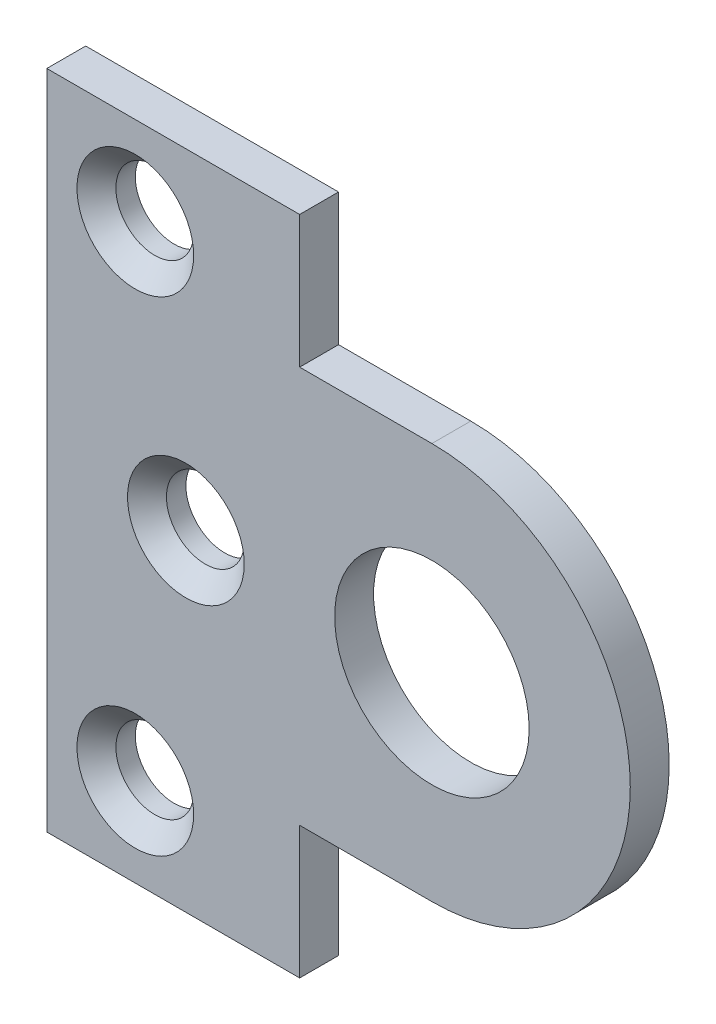
ISO-10303-21;
HEADER;
FILE_DESCRIPTION(('STEP AP214'),'2;1');
FILE_NAME('part.step','',(''),(''),'','','');
FILE_SCHEMA(('AUTOMOTIVE_DESIGN { 1 0 10303 214 1 1 1 1 }'));
ENDSEC;
DATA;
#1=APPLICATION_CONTEXT('core data for automotive mechanical design processes');
#2=APPLICATION_PROTOCOL_DEFINITION('international standard','automotive_design',2000,#1);
#3=PRODUCT_CONTEXT('',#1,'mechanical');
#4=PRODUCT('Part','Part','',(#3));
#5=PRODUCT_RELATED_PRODUCT_CATEGORY('part','',(#4));
#6=PRODUCT_DEFINITION_FORMATION('','',#4);
#7=PRODUCT_DEFINITION_CONTEXT('part definition',#1,'design');
#8=PRODUCT_DEFINITION('design','',#6,#7);
#9=PRODUCT_DEFINITION_SHAPE('','',#8);
#10=(LENGTH_UNIT() NAMED_UNIT(*) SI_UNIT(.MILLI.,.METRE.));
#11=(NAMED_UNIT(*) PLANE_ANGLE_UNIT() SI_UNIT($,.RADIAN.));
#12=(NAMED_UNIT(*) SI_UNIT($,.STERADIAN.) SOLID_ANGLE_UNIT());
#13=UNCERTAINTY_MEASURE_WITH_UNIT(LENGTH_MEASURE(1.E-05),#10,'distance_accuracy_value','');
#14=(GEOMETRIC_REPRESENTATION_CONTEXT(3) GLOBAL_UNCERTAINTY_ASSIGNED_CONTEXT((#13)) GLOBAL_UNIT_ASSIGNED_CONTEXT((#10,
#11,#12)) REPRESENTATION_CONTEXT('',''));
#15=CARTESIAN_POINT('',(0.,0.,0.));
#16=DIRECTION('',(0.,0.,1.));
#17=DIRECTION('',(1.,0.,0.));
#18=AXIS2_PLACEMENT_3D('',#15,#16,#17);
#19=CARTESIAN_POINT('',(0.,0.,3.175));
#20=DIRECTION('',(0.,0.,1.));
#21=DIRECTION('',(1.,0.,0.));
#22=AXIS2_PLACEMENT_3D('',#19,#20,#21);
#23=PLANE('',#22);
#24=CARTESIAN_POINT('',(-24.209375,-19.764375,3.175));
#25=DIRECTION('',(0.,0.,1.));
#26=DIRECTION('',(1.,0.,0.));
#27=AXIS2_PLACEMENT_3D('',#24,#25,#26);
#28=CIRCLE('',#27,4.7625);
#29=CARTESIAN_POINT('',(-19.446875,-19.764375,3.175));
#30=VERTEX_POINT('',#29);
#31=EDGE_CURVE('E198',#30,#30,#28,.F.);
#32=ORIENTED_EDGE('',*,*,#31,.T.);
#33=EDGE_LOOP('',(#32));
#34=FACE_BOUND('',#33,.T.);
#35=CARTESIAN_POINT('',(-20.081875,0.,3.175));
#36=DIRECTION('',(0.,0.,1.));
#37=DIRECTION('',(1.,0.,0.));
#38=AXIS2_PLACEMENT_3D('',#35,#36,#37);
#39=CIRCLE('',#38,4.7625);
#40=CARTESIAN_POINT('',(-15.319375,0.,3.175));
#41=VERTEX_POINT('',#40);
#42=EDGE_CURVE('E194',#41,#41,#39,.F.);
#43=ORIENTED_EDGE('',*,*,#42,.T.);
#44=EDGE_LOOP('',(#43));
#45=FACE_BOUND('',#44,.T.);
#46=CARTESIAN_POINT('',(-24.209375,19.764375,3.175));
#47=DIRECTION('',(0.,0.,1.));
#48=DIRECTION('',(1.,0.,0.));
#49=AXIS2_PLACEMENT_3D('',#46,#47,#48);
#50=CIRCLE('',#49,4.7625);
#51=CARTESIAN_POINT('',(-19.446875,19.764375,3.175));
#52=VERTEX_POINT('',#51);
#53=EDGE_CURVE('E190',#52,#52,#50,.F.);
#54=ORIENTED_EDGE('',*,*,#53,.T.);
#55=EDGE_LOOP('',(#54));
#56=FACE_BOUND('',#55,.T.);
#57=CARTESIAN_POINT('',(0.,0.,3.175));
#58=DIRECTION('',(0.,0.,1.));
#59=DIRECTION('',(1.,0.,0.));
#60=AXIS2_PLACEMENT_3D('',#57,#58,#59);
#61=CIRCLE('',#60,7.9375);
#62=CARTESIAN_POINT('',(7.9375,0.,3.175));
#63=VERTEX_POINT('',#62);
#64=EDGE_CURVE('E146',#63,#63,#61,.T.);
#65=ORIENTED_EDGE('',*,*,#64,.F.);
#66=EDGE_LOOP('',(#65));
#67=FACE_BOUND('',#66,.T.);
#68=CARTESIAN_POINT('',(0.,0.,3.175));
#69=DIRECTION('',(0.,0.,1.));
#70=DIRECTION('',(1.,0.,0.));
#71=AXIS2_PLACEMENT_3D('',#68,#69,#70);
#72=CIRCLE('',#71,16.1925);
#73=CARTESIAN_POINT('',(0.,-16.1925,3.175));
#74=VERTEX_POINT('',#73);
#75=CARTESIAN_POINT('',(0.,16.1925,3.175));
#76=VERTEX_POINT('',#75);
#77=EDGE_CURVE('E164',#74,#76,#72,.T.);
#78=ORIENTED_EDGE('',*,*,#77,.T.);
#79=DIRECTION('',(-1.,0.,0.));
#80=VECTOR('',#79,1.);
#81=CARTESIAN_POINT('',(0.,16.1925,3.175));
#82=LINE('',#81,#80);
#83=CARTESIAN_POINT('',(-10.795,16.1925,3.175));
#84=VERTEX_POINT('',#83);
#85=EDGE_CURVE('E101',#76,#84,#82,.T.);
#86=ORIENTED_EDGE('',*,*,#85,.T.);
#87=DIRECTION('',(0.,1.,0.));
#88=VECTOR('',#87,1.);
#89=CARTESIAN_POINT('',(-10.795,16.1925,3.175));
#90=LINE('',#89,#88);
#91=CARTESIAN_POINT('',(-10.795,26.9875,3.175));
#92=VERTEX_POINT('',#91);
#93=EDGE_CURVE('E271',#84,#92,#90,.T.);
#94=ORIENTED_EDGE('',*,*,#93,.T.);
#95=DIRECTION('',(-1.,0.,0.));
#96=VECTOR('',#95,1.);
#97=CARTESIAN_POINT('',(-10.795,26.9875,3.175));
#98=LINE('',#97,#96);
#99=CARTESIAN_POINT('',(-31.4325,26.9875,3.175));
#100=VERTEX_POINT('',#99);
#101=EDGE_CURVE('E274',#92,#100,#98,.T.);
#102=ORIENTED_EDGE('',*,*,#101,.T.);
#103=DIRECTION('',(0.,-1.,0.));
#104=VECTOR('',#103,1.);
#105=CARTESIAN_POINT('',(-31.4325,26.9875,3.175));
#106=LINE('',#105,#104);
#107=CARTESIAN_POINT('',(-31.4325,-26.9875,3.175));
#108=VERTEX_POINT('',#107);
#109=EDGE_CURVE('E119',#100,#108,#106,.T.);
#110=ORIENTED_EDGE('',*,*,#109,.T.);
#111=DIRECTION('',(1.,0.,0.));
#112=VECTOR('',#111,1.);
#113=CARTESIAN_POINT('',(-31.4325,-26.9875,3.175));
#114=LINE('',#113,#112);
#115=CARTESIAN_POINT('',(-10.795,-26.9875,3.175));
#116=VERTEX_POINT('',#115);
#117=EDGE_CURVE('E114',#108,#116,#114,.T.);
#118=ORIENTED_EDGE('',*,*,#117,.T.);
#119=DIRECTION('',(0.,1.,0.));
#120=VECTOR('',#119,1.);
#121=CARTESIAN_POINT('',(-10.795,-26.9875,3.175));
#122=LINE('',#121,#120);
#123=CARTESIAN_POINT('',(-10.795,-16.1925,3.175));
#124=VERTEX_POINT('',#123);
#125=EDGE_CURVE('E117',#116,#124,#122,.T.);
#126=ORIENTED_EDGE('',*,*,#125,.T.);
#127=DIRECTION('',(1.,0.,0.));
#128=VECTOR('',#127,1.);
#129=CARTESIAN_POINT('',(-10.795,-16.1925,3.175));
#130=LINE('',#129,#128);
#131=EDGE_CURVE('E57',#124,#74,#130,.T.);
#132=ORIENTED_EDGE('',*,*,#131,.T.);
#133=EDGE_LOOP('',(#78,#86,#94,#102,#110,#118,#126,#132));
#134=FACE_BOUND('',#133,.T.);
#135=ADVANCED_FACE('F39',(#34,#45,#56,#67,#134),#23,.T.);
#136=CARTESIAN_POINT('',(0.,0.,0.));
#137=DIRECTION('',(0.,0.,1.));
#138=DIRECTION('',(1.,0.,0.));
#139=AXIS2_PLACEMENT_3D('',#136,#137,#138);
#140=PLANE('',#139);
#141=CARTESIAN_POINT('',(-20.081875,0.,0.));
#142=DIRECTION('',(0.,0.,1.));
#143=DIRECTION('',(1.,0.,0.));
#144=AXIS2_PLACEMENT_3D('',#141,#142,#143);
#145=CIRCLE('',#144,3.175);
#146=CARTESIAN_POINT('',(-16.906875,0.,0.));
#147=VERTEX_POINT('',#146);
#148=EDGE_CURVE('E295',#147,#147,#145,.T.);
#149=ORIENTED_EDGE('',*,*,#148,.T.);
#150=EDGE_LOOP('',(#149));
#151=FACE_BOUND('',#150,.T.);
#152=CARTESIAN_POINT('',(0.,0.,0.));
#153=DIRECTION('',(0.,0.,1.));
#154=DIRECTION('',(1.,0.,0.));
#155=AXIS2_PLACEMENT_3D('',#152,#153,#154);
#156=CIRCLE('',#155,7.9375);
#157=CARTESIAN_POINT('',(7.9375,0.,0.));
#158=VERTEX_POINT('',#157);
#159=EDGE_CURVE('E284',#158,#158,#156,.T.);
#160=ORIENTED_EDGE('',*,*,#159,.T.);
#161=EDGE_LOOP('',(#160));
#162=FACE_BOUND('',#161,.T.);
#163=CARTESIAN_POINT('',(0.,0.,0.));
#164=DIRECTION('',(0.,0.,1.));
#165=DIRECTION('',(1.,0.,0.));
#166=AXIS2_PLACEMENT_3D('',#163,#164,#165);
#167=CIRCLE('',#166,16.1925);
#168=CARTESIAN_POINT('',(0.,-16.1925,0.));
#169=VERTEX_POINT('',#168);
#170=CARTESIAN_POINT('',(0.,16.1925,0.));
#171=VERTEX_POINT('',#170);
#172=EDGE_CURVE('E141',#169,#171,#167,.T.);
#173=ORIENTED_EDGE('',*,*,#172,.F.);
#174=DIRECTION('',(1.,0.,0.));
#175=VECTOR('',#174,1.);
#176=CARTESIAN_POINT('',(-10.795,-16.1925,0.));
#177=LINE('',#176,#175);
#178=CARTESIAN_POINT('',(-10.795,-16.1925,0.));
#179=VERTEX_POINT('',#178);
#180=EDGE_CURVE('E92',#179,#169,#177,.T.);
#181=ORIENTED_EDGE('',*,*,#180,.F.);
#182=DIRECTION('',(0.,1.,0.));
#183=VECTOR('',#182,1.);
#184=CARTESIAN_POINT('',(-10.795,-26.9875,0.));
#185=LINE('',#184,#183);
#186=CARTESIAN_POINT('',(-10.795,-26.9875,0.));
#187=VERTEX_POINT('',#186);
#188=EDGE_CURVE('E86',#187,#179,#185,.T.);
#189=ORIENTED_EDGE('',*,*,#188,.F.);
#190=DIRECTION('',(1.,0.,0.));
#191=VECTOR('',#190,1.);
#192=CARTESIAN_POINT('',(-31.4325,-26.9875,0.));
#193=LINE('',#192,#191);
#194=CARTESIAN_POINT('',(-31.4325,-26.9875,0.));
#195=VERTEX_POINT('',#194);
#196=EDGE_CURVE('E128',#195,#187,#193,.T.);
#197=ORIENTED_EDGE('',*,*,#196,.F.);
#198=DIRECTION('',(0.,-1.,0.));
#199=VECTOR('',#198,1.);
#200=CARTESIAN_POINT('',(-31.4325,26.9875,0.));
#201=LINE('',#200,#199);
#202=CARTESIAN_POINT('',(-31.4325,26.9875,0.));
#203=VERTEX_POINT('',#202);
#204=EDGE_CURVE('E155',#203,#195,#201,.T.);
#205=ORIENTED_EDGE('',*,*,#204,.F.);
#206=DIRECTION('',(-1.,0.,0.));
#207=VECTOR('',#206,1.);
#208=CARTESIAN_POINT('',(-10.795,26.9875,0.));
#209=LINE('',#208,#207);
#210=CARTESIAN_POINT('',(-10.795,26.9875,0.));
#211=VERTEX_POINT('',#210);
#212=EDGE_CURVE('E152',#211,#203,#209,.T.);
#213=ORIENTED_EDGE('',*,*,#212,.F.);
#214=DIRECTION('',(0.,1.,0.));
#215=VECTOR('',#214,1.);
#216=CARTESIAN_POINT('',(-10.795,16.1925,0.));
#217=LINE('',#216,#215);
#218=CARTESIAN_POINT('',(-10.795,16.1925,0.));
#219=VERTEX_POINT('',#218);
#220=EDGE_CURVE('E149',#219,#211,#217,.T.);
#221=ORIENTED_EDGE('',*,*,#220,.F.);
#222=DIRECTION('',(-1.,0.,0.));
#223=VECTOR('',#222,1.);
#224=CARTESIAN_POINT('',(0.,16.1925,0.));
#225=LINE('',#224,#223);
#226=EDGE_CURVE('E145',#171,#219,#225,.T.);
#227=ORIENTED_EDGE('',*,*,#226,.F.);
#228=EDGE_LOOP('',(#173,#181,#189,#197,#205,#213,#221,#227));
#229=FACE_BOUND('',#228,.T.);
#230=CARTESIAN_POINT('',(-24.209375,19.764375,0.));
#231=DIRECTION('',(0.,0.,1.));
#232=DIRECTION('',(1.,0.,0.));
#233=AXIS2_PLACEMENT_3D('',#230,#231,#232);
#234=CIRCLE('',#233,3.175);
#235=CARTESIAN_POINT('',(-21.034375,19.764375,0.));
#236=VERTEX_POINT('',#235);
#237=EDGE_CURVE('E288',#236,#236,#234,.T.);
#238=ORIENTED_EDGE('',*,*,#237,.T.);
#239=EDGE_LOOP('',(#238));
#240=FACE_BOUND('',#239,.T.);
#241=CARTESIAN_POINT('',(-24.209375,-19.764375,0.));
#242=DIRECTION('',(0.,0.,1.));
#243=DIRECTION('',(1.,0.,0.));
#244=AXIS2_PLACEMENT_3D('',#241,#242,#243);
#245=CIRCLE('',#244,3.175);
#246=CARTESIAN_POINT('',(-21.034375,-19.764375,0.));
#247=VERTEX_POINT('',#246);
#248=EDGE_CURVE('E299',#247,#247,#245,.T.);
#249=ORIENTED_EDGE('',*,*,#248,.T.);
#250=EDGE_LOOP('',(#249));
#251=FACE_BOUND('',#250,.T.);
#252=ADVANCED_FACE('F222',(#151,#162,#229,#240,#251),#140,.F.);
#253=CARTESIAN_POINT('',(0.,0.,3.175));
#254=DIRECTION('',(0.,0.,-1.));
#255=DIRECTION('',(-1.,0.,0.));
#256=AXIS2_PLACEMENT_3D('',#253,#254,#255);
#257=CYLINDRICAL_SURFACE('',#256,16.1925);
#258=ORIENTED_EDGE('',*,*,#172,.T.);
#259=DIRECTION('',(0.,0.,-1.));
#260=VECTOR('',#259,1.);
#261=CARTESIAN_POINT('',(0.,16.1925,3.175));
#262=LINE('',#261,#260);
#263=EDGE_CURVE('E183',#76,#171,#262,.T.);
#264=ORIENTED_EDGE('',*,*,#263,.F.);
#265=ORIENTED_EDGE('',*,*,#77,.F.);
#266=DIRECTION('',(0.,0.,-1.));
#267=VECTOR('',#266,1.);
#268=CARTESIAN_POINT('',(0.,-16.1925,3.175));
#269=LINE('',#268,#267);
#270=EDGE_CURVE('E137',#74,#169,#269,.T.);
#271=ORIENTED_EDGE('',*,*,#270,.T.);
#272=EDGE_LOOP('',(#258,#264,#265,#271));
#273=FACE_BOUND('',#272,.T.);
#274=ADVANCED_FACE('F228',(#273),#257,.T.);
#275=CARTESIAN_POINT('',(0.,16.1925,3.175));
#276=DIRECTION('',(0.,-1.,0.));
#277=DIRECTION('',(0.,0.,-1.));
#278=AXIS2_PLACEMENT_3D('',#275,#276,#277);
#279=PLANE('',#278);
#280=ORIENTED_EDGE('',*,*,#226,.T.);
#281=DIRECTION('',(0.,0.,-1.));
#282=VECTOR('',#281,1.);
#283=CARTESIAN_POINT('',(-10.795,16.1925,3.175));
#284=LINE('',#283,#282);
#285=EDGE_CURVE('E179',#84,#219,#284,.T.);
#286=ORIENTED_EDGE('',*,*,#285,.F.);
#287=ORIENTED_EDGE('',*,*,#85,.F.);
#288=ORIENTED_EDGE('',*,*,#263,.T.);
#289=EDGE_LOOP('',(#280,#286,#287,#288));
#290=FACE_BOUND('',#289,.T.);
#291=ADVANCED_FACE('F254',(#290),#279,.F.);
#292=CARTESIAN_POINT('',(-10.795,16.1925,3.175));
#293=DIRECTION('',(-1.,0.,0.));
#294=DIRECTION('',(0.,0.,1.));
#295=AXIS2_PLACEMENT_3D('',#292,#293,#294);
#296=PLANE('',#295);
#297=ORIENTED_EDGE('',*,*,#220,.T.);
#298=DIRECTION('',(0.,0.,-1.));
#299=VECTOR('',#298,1.);
#300=CARTESIAN_POINT('',(-10.795,26.9875,3.175));
#301=LINE('',#300,#299);
#302=EDGE_CURVE('E175',#92,#211,#301,.T.);
#303=ORIENTED_EDGE('',*,*,#302,.F.);
#304=ORIENTED_EDGE('',*,*,#93,.F.);
#305=ORIENTED_EDGE('',*,*,#285,.T.);
#306=EDGE_LOOP('',(#297,#303,#304,#305));
#307=FACE_BOUND('',#306,.T.);
#308=ADVANCED_FACE('F250',(#307),#296,.F.);
#309=CARTESIAN_POINT('',(-10.795,26.9875,3.175));
#310=DIRECTION('',(0.,-1.,0.));
#311=DIRECTION('',(0.,0.,-1.));
#312=AXIS2_PLACEMENT_3D('',#309,#310,#311);
#313=PLANE('',#312);
#314=ORIENTED_EDGE('',*,*,#212,.T.);
#315=DIRECTION('',(0.,0.,-1.));
#316=VECTOR('',#315,1.);
#317=CARTESIAN_POINT('',(-31.4325,26.9875,3.175));
#318=LINE('',#317,#316);
#319=EDGE_CURVE('E171',#100,#203,#318,.T.);
#320=ORIENTED_EDGE('',*,*,#319,.F.);
#321=ORIENTED_EDGE('',*,*,#101,.F.);
#322=ORIENTED_EDGE('',*,*,#302,.T.);
#323=EDGE_LOOP('',(#314,#320,#321,#322));
#324=FACE_BOUND('',#323,.T.);
#325=ADVANCED_FACE('F246',(#324),#313,.F.);
#326=CARTESIAN_POINT('',(-31.4325,26.9875,3.175));
#327=DIRECTION('',(1.,0.,0.));
#328=DIRECTION('',(0.,0.,-1.));
#329=AXIS2_PLACEMENT_3D('',#326,#327,#328);
#330=PLANE('',#329);
#331=ORIENTED_EDGE('',*,*,#204,.T.);
#332=DIRECTION('',(0.,0.,-1.));
#333=VECTOR('',#332,1.);
#334=CARTESIAN_POINT('',(-31.4325,-26.9875,3.175));
#335=LINE('',#334,#333);
#336=EDGE_CURVE('E130',#108,#195,#335,.T.);
#337=ORIENTED_EDGE('',*,*,#336,.F.);
#338=ORIENTED_EDGE('',*,*,#109,.F.);
#339=ORIENTED_EDGE('',*,*,#319,.T.);
#340=EDGE_LOOP('',(#331,#337,#338,#339));
#341=FACE_BOUND('',#340,.T.);
#342=ADVANCED_FACE('F243',(#341),#330,.F.);
#343=CARTESIAN_POINT('',(-31.4325,-26.9875,3.175));
#344=DIRECTION('',(0.,1.,0.));
#345=DIRECTION('',(0.,0.,1.));
#346=AXIS2_PLACEMENT_3D('',#343,#344,#345);
#347=PLANE('',#346);
#348=ORIENTED_EDGE('',*,*,#196,.T.);
#349=DIRECTION('',(0.,0.,-1.));
#350=VECTOR('',#349,1.);
#351=CARTESIAN_POINT('',(-10.795,-26.9875,3.175));
#352=LINE('',#351,#350);
#353=EDGE_CURVE('E125',#116,#187,#352,.T.);
#354=ORIENTED_EDGE('',*,*,#353,.F.);
#355=ORIENTED_EDGE('',*,*,#117,.F.);
#356=ORIENTED_EDGE('',*,*,#336,.T.);
#357=EDGE_LOOP('',(#348,#354,#355,#356));
#358=FACE_BOUND('',#357,.T.);
#359=ADVANCED_FACE('F126',(#358),#347,.F.);
#360=CARTESIAN_POINT('',(-10.795,-26.9875,3.175));
#361=DIRECTION('',(-1.,0.,0.));
#362=DIRECTION('',(0.,0.,1.));
#363=AXIS2_PLACEMENT_3D('',#360,#361,#362);
#364=PLANE('',#363);
#365=ORIENTED_EDGE('',*,*,#188,.T.);
#366=DIRECTION('',(0.,0.,-1.));
#367=VECTOR('',#366,1.);
#368=CARTESIAN_POINT('',(-10.795,-16.1925,3.175));
#369=LINE('',#368,#367);
#370=EDGE_CURVE('E131',#124,#179,#369,.T.);
#371=ORIENTED_EDGE('',*,*,#370,.F.);
#372=ORIENTED_EDGE('',*,*,#125,.F.);
#373=ORIENTED_EDGE('',*,*,#353,.T.);
#374=EDGE_LOOP('',(#365,#371,#372,#373));
#375=FACE_BOUND('',#374,.T.);
#376=ADVANCED_FACE('F133',(#375),#364,.F.);
#377=CARTESIAN_POINT('',(-10.795,-16.1925,3.175));
#378=DIRECTION('',(0.,1.,0.));
#379=DIRECTION('',(0.,0.,1.));
#380=AXIS2_PLACEMENT_3D('',#377,#378,#379);
#381=PLANE('',#380);
#382=ORIENTED_EDGE('',*,*,#180,.T.);
#383=ORIENTED_EDGE('',*,*,#270,.F.);
#384=ORIENTED_EDGE('',*,*,#131,.F.);
#385=ORIENTED_EDGE('',*,*,#370,.T.);
#386=EDGE_LOOP('',(#382,#383,#384,#385));
#387=FACE_BOUND('',#386,.T.);
#388=ADVANCED_FACE('F236',(#387),#381,.F.);
#389=CARTESIAN_POINT('',(0.,0.,3.175));
#390=DIRECTION('',(0.,0.,-1.));
#391=DIRECTION('',(-1.,0.,0.));
#392=AXIS2_PLACEMENT_3D('',#389,#390,#391);
#393=CYLINDRICAL_SURFACE('',#392,7.9375);
#394=ORIENTED_EDGE('',*,*,#64,.T.);
#395=EDGE_LOOP('',(#394));
#396=FACE_BOUND('',#395,.T.);
#397=ORIENTED_EDGE('',*,*,#159,.F.);
#398=EDGE_LOOP('',(#397));
#399=FACE_BOUND('',#398,.T.);
#400=ADVANCED_FACE('F233',(#396,#399),#393,.F.);
#401=CARTESIAN_POINT('',(-24.209375,19.764375,3.175));
#402=DIRECTION('',(0.,0.,-1.));
#403=DIRECTION('',(-1.,0.,0.));
#404=AXIS2_PLACEMENT_3D('',#401,#402,#403);
#405=CYLINDRICAL_SURFACE('',#404,3.175);
#406=CARTESIAN_POINT('',(-24.209375,19.764375,1.58750000000002));
#407=DIRECTION('',(0.,0.,1.));
#408=DIRECTION('',(1.,0.,0.));
#409=AXIS2_PLACEMENT_3D('',#406,#407,#408);
#410=CIRCLE('',#409,3.175);
#411=CARTESIAN_POINT('',(-21.034375,19.764375,1.58750000000002));
#412=VERTEX_POINT('',#411);
#413=EDGE_CURVE('E11',#412,#412,#410,.T.);
#414=ORIENTED_EDGE('',*,*,#413,.T.);
#415=EDGE_LOOP('',(#414));
#416=FACE_BOUND('',#415,.T.);
#417=ORIENTED_EDGE('',*,*,#237,.F.);
#418=EDGE_LOOP('',(#417));
#419=FACE_BOUND('',#418,.T.);
#420=ADVANCED_FACE('F311',(#416,#419),#405,.F.);
#421=CARTESIAN_POINT('',(-20.081875,0.,3.175));
#422=DIRECTION('',(0.,0.,-1.));
#423=DIRECTION('',(-1.,0.,0.));
#424=AXIS2_PLACEMENT_3D('',#421,#422,#423);
#425=CYLINDRICAL_SURFACE('',#424,3.175);
#426=CARTESIAN_POINT('',(-20.081875,0.,1.58750000000002));
#427=DIRECTION('',(0.,0.,1.));
#428=DIRECTION('',(1.,0.,0.));
#429=AXIS2_PLACEMENT_3D('',#426,#427,#428);
#430=CIRCLE('',#429,3.175);
#431=CARTESIAN_POINT('',(-16.906875,0.,1.58750000000002));
#432=VERTEX_POINT('',#431);
#433=EDGE_CURVE('E49',#432,#432,#430,.T.);
#434=ORIENTED_EDGE('',*,*,#433,.T.);
#435=EDGE_LOOP('',(#434));
#436=FACE_BOUND('',#435,.T.);
#437=ORIENTED_EDGE('',*,*,#148,.F.);
#438=EDGE_LOOP('',(#437));
#439=FACE_BOUND('',#438,.T.);
#440=ADVANCED_FACE('F205',(#436,#439),#425,.F.);
#441=CARTESIAN_POINT('',(-24.209375,-19.764375,3.175));
#442=DIRECTION('',(0.,0.,-1.));
#443=DIRECTION('',(-1.,0.,0.));
#444=AXIS2_PLACEMENT_3D('',#441,#442,#443);
#445=CYLINDRICAL_SURFACE('',#444,3.175);
#446=CARTESIAN_POINT('',(-24.209375,-19.764375,1.58750000000002));
#447=DIRECTION('',(0.,0.,1.));
#448=DIRECTION('',(1.,0.,0.));
#449=AXIS2_PLACEMENT_3D('',#446,#447,#448);
#450=CIRCLE('',#449,3.175);
#451=CARTESIAN_POINT('',(-21.034375,-19.764375,1.58750000000002));
#452=VERTEX_POINT('',#451);
#453=EDGE_CURVE('E186',#452,#452,#450,.T.);
#454=ORIENTED_EDGE('',*,*,#453,.T.);
#455=EDGE_LOOP('',(#454));
#456=FACE_BOUND('',#455,.T.);
#457=ORIENTED_EDGE('',*,*,#248,.F.);
#458=EDGE_LOOP('',(#457));
#459=FACE_BOUND('',#458,.T.);
#460=ADVANCED_FACE('F217',(#456,#459),#445,.F.);
#461=CARTESIAN_POINT('',(-24.209375,-19.764375,1.58750000000002));
#462=DIRECTION('',(0.,0.,1.));
#463=DIRECTION('',(1.,0.,0.));
#464=AXIS2_PLACEMENT_3D('',#461,#462,#463);
#465=CONICAL_SURFACE('',#464,3.175,0.785398163397453);
#466=ORIENTED_EDGE('',*,*,#31,.F.);
#467=EDGE_LOOP('',(#466));
#468=FACE_BOUND('',#467,.T.);
#469=ORIENTED_EDGE('',*,*,#453,.F.);
#470=EDGE_LOOP('',(#469));
#471=FACE_BOUND('',#470,.T.);
#472=ADVANCED_FACE('F210',(#468,#471),#465,.F.);
#473=CARTESIAN_POINT('',(-20.081875,0.,1.58750000000002));
#474=DIRECTION('',(0.,0.,1.));
#475=DIRECTION('',(1.,0.,0.));
#476=AXIS2_PLACEMENT_3D('',#473,#474,#475);
#477=CONICAL_SURFACE('',#476,3.175,0.785398163397453);
#478=ORIENTED_EDGE('',*,*,#42,.F.);
#479=EDGE_LOOP('',(#478));
#480=FACE_BOUND('',#479,.T.);
#481=ORIENTED_EDGE('',*,*,#433,.F.);
#482=EDGE_LOOP('',(#481));
#483=FACE_BOUND('',#482,.T.);
#484=ADVANCED_FACE('F208',(#480,#483),#477,.F.);
#485=CARTESIAN_POINT('',(-24.209375,19.764375,1.58750000000002));
#486=DIRECTION('',(0.,0.,1.));
#487=DIRECTION('',(1.,0.,0.));
#488=AXIS2_PLACEMENT_3D('',#485,#486,#487);
#489=CONICAL_SURFACE('',#488,3.175,0.785398163397453);
#490=ORIENTED_EDGE('',*,*,#53,.F.);
#491=EDGE_LOOP('',(#490));
#492=FACE_BOUND('',#491,.T.);
#493=ORIENTED_EDGE('',*,*,#413,.F.);
#494=EDGE_LOOP('',(#493));
#495=FACE_BOUND('',#494,.T.);
#496=ADVANCED_FACE('F41',(#492,#495),#489,.F.);
#497=CLOSED_SHELL('',(#135,#252,#274,#291,#308,#325,#342,#359,#376,#388,#400,#420,#440,#460,
#472,#484,#496));
#498=MANIFOLD_SOLID_BREP('B2',#497);
#499=ADVANCED_BREP_SHAPE_REPRESENTATION('',(#18,#498),#14);
#500=SHAPE_DEFINITION_REPRESENTATION(#9,#499);
ENDSEC;
END-ISO-10303-21;
